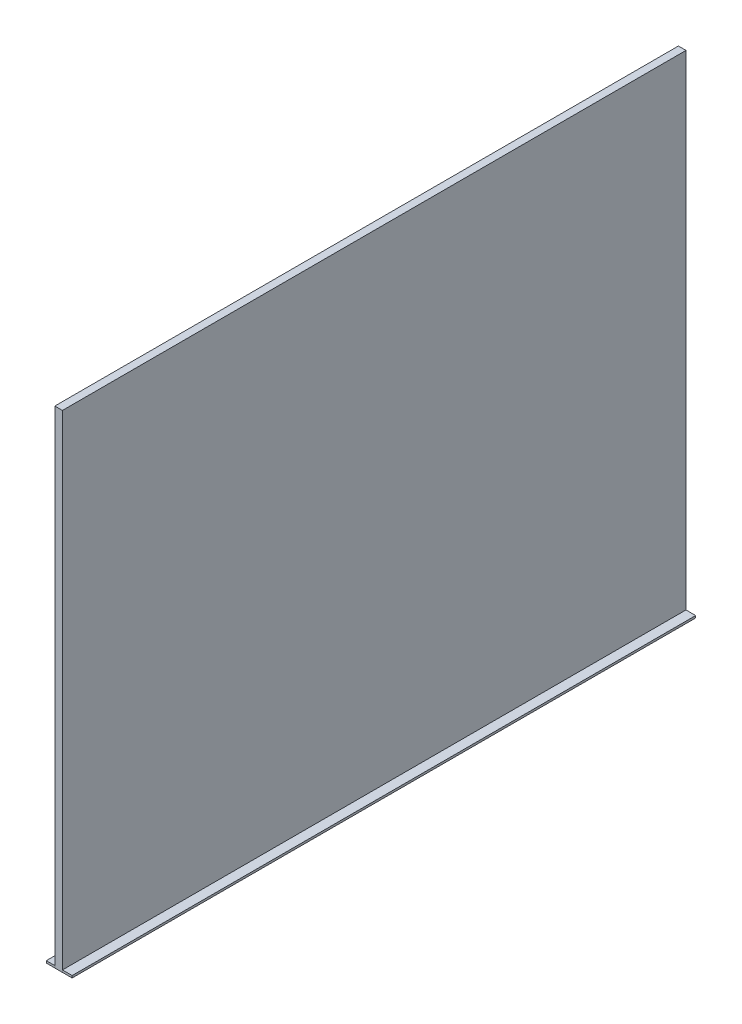
ISO-10303-21;
HEADER;
FILE_DESCRIPTION(('STEP AP214'),'2;1');
FILE_NAME('part.step','',(''),(''),'','','');
FILE_SCHEMA(('AUTOMOTIVE_DESIGN { 1 0 10303 214 1 1 1 1 }'));
ENDSEC;
DATA;
#1=APPLICATION_CONTEXT('core data for automotive mechanical design processes');
#2=APPLICATION_PROTOCOL_DEFINITION('international standard','automotive_design',2000,#1);
#3=PRODUCT_CONTEXT('',#1,'mechanical');
#4=PRODUCT('Part','Part','',(#3));
#5=PRODUCT_RELATED_PRODUCT_CATEGORY('part','',(#4));
#6=PRODUCT_DEFINITION_FORMATION('','',#4);
#7=PRODUCT_DEFINITION_CONTEXT('part definition',#1,'design');
#8=PRODUCT_DEFINITION('design','',#6,#7);
#9=PRODUCT_DEFINITION_SHAPE('','',#8);
#10=(LENGTH_UNIT() NAMED_UNIT(*) SI_UNIT(.MILLI.,.METRE.));
#11=(NAMED_UNIT(*) PLANE_ANGLE_UNIT() SI_UNIT($,.RADIAN.));
#12=(NAMED_UNIT(*) SI_UNIT($,.STERADIAN.) SOLID_ANGLE_UNIT());
#13=UNCERTAINTY_MEASURE_WITH_UNIT(LENGTH_MEASURE(1.E-05),#10,'distance_accuracy_value','');
#14=(GEOMETRIC_REPRESENTATION_CONTEXT(3) GLOBAL_UNCERTAINTY_ASSIGNED_CONTEXT((#13)) GLOBAL_UNIT_ASSIGNED_CONTEXT((#10,
#11,#12)) REPRESENTATION_CONTEXT('',''));
#15=CARTESIAN_POINT('',(0.,0.,0.));
#16=DIRECTION('',(0.,0.,1.));
#17=DIRECTION('',(1.,0.,0.));
#18=AXIS2_PLACEMENT_3D('',#15,#16,#17);
#19=CARTESIAN_POINT('',(0.,160.,0.));
#20=DIRECTION('',(1.,0.,0.));
#21=DIRECTION('',(0.,0.,-1.));
#22=AXIS2_PLACEMENT_3D('',#19,#20,#21);
#23=PLANE('',#22);
#24=DIRECTION('',(0.,1.,0.));
#25=VECTOR('',#24,1.);
#26=CARTESIAN_POINT('',(0.,160.,204.984421923481));
#27=LINE('',#26,#25);
#28=CARTESIAN_POINT('',(0.,0.,204.984421923481));
#29=VERTEX_POINT('',#28);
#30=CARTESIAN_POINT('',(0.,0.700000000000006,204.984421923481));
#31=VERTEX_POINT('',#30);
#32=EDGE_CURVE('E122',#29,#31,#27,.T.);
#33=ORIENTED_EDGE('',*,*,#32,.F.);
#34=DIRECTION('',(0.,0.,1.));
#35=VECTOR('',#34,1.);
#36=CARTESIAN_POINT('',(0.,0.,0.));
#37=LINE('',#36,#35);
#38=CARTESIAN_POINT('',(0.,0.,205.));
#39=VERTEX_POINT('',#38);
#40=EDGE_CURVE('E152',#29,#39,#37,.T.);
#41=ORIENTED_EDGE('',*,*,#40,.T.);
#42=DIRECTION('',(0.,-1.,0.));
#43=VECTOR('',#42,1.);
#44=CARTESIAN_POINT('',(0.,160.,205.));
#45=LINE('',#44,#43);
#46=CARTESIAN_POINT('',(0.,160.,205.));
#47=VERTEX_POINT('',#46);
#48=EDGE_CURVE('E11',#47,#39,#45,.T.);
#49=ORIENTED_EDGE('',*,*,#48,.F.);
#50=DIRECTION('',(0.,0.,1.));
#51=VECTOR('',#50,1.);
#52=CARTESIAN_POINT('',(0.,160.,0.));
#53=LINE('',#52,#51);
#54=CARTESIAN_POINT('',(0.,160.,0.));
#55=VERTEX_POINT('',#54);
#56=EDGE_CURVE('E153',#55,#47,#53,.T.);
#57=ORIENTED_EDGE('',*,*,#56,.F.);
#58=DIRECTION('',(0.,-1.,0.));
#59=VECTOR('',#58,1.);
#60=CARTESIAN_POINT('',(0.,160.,0.));
#61=LINE('',#60,#59);
#62=CARTESIAN_POINT('',(0.,0.700000000000006,0.));
#63=VERTEX_POINT('',#62);
#64=EDGE_CURVE('E163',#55,#63,#61,.T.);
#65=ORIENTED_EDGE('',*,*,#64,.T.);
#66=DIRECTION('',(0.,0.,1.));
#67=VECTOR('',#66,1.);
#68=CARTESIAN_POINT('',(0.,0.700000000000006,0.));
#69=LINE('',#68,#67);
#70=EDGE_CURVE('E52',#63,#31,#69,.T.);
#71=ORIENTED_EDGE('',*,*,#70,.T.);
#72=EDGE_LOOP('',(#33,#41,#49,#57,#65,#71));
#73=FACE_BOUND('',#72,.T.);
#74=ADVANCED_FACE('F38',(#73),#23,.F.);
#75=CARTESIAN_POINT('',(2.5,160.,0.));
#76=DIRECTION('',(-1.,0.,0.));
#77=DIRECTION('',(0.,0.,1.));
#78=AXIS2_PLACEMENT_3D('',#75,#76,#77);
#79=PLANE('',#78);
#80=DIRECTION('',(0.,-1.,0.));
#81=VECTOR('',#80,1.);
#82=CARTESIAN_POINT('',(2.50000000000004,160.,204.984421923481));
#83=LINE('',#82,#81);
#84=CARTESIAN_POINT('',(2.50000000000004,0.700000000000006,204.984421923481));
#85=VERTEX_POINT('',#84);
#86=CARTESIAN_POINT('',(2.50000000000004,0.,204.984421923481));
#87=VERTEX_POINT('',#86);
#88=EDGE_CURVE('E60',#85,#87,#83,.T.);
#89=ORIENTED_EDGE('',*,*,#88,.F.);
#90=DIRECTION('',(0.,0.,-1.));
#91=VECTOR('',#90,1.);
#92=CARTESIAN_POINT('',(2.5,0.700000000000006,0.));
#93=LINE('',#92,#91);
#94=CARTESIAN_POINT('',(2.5,0.700000000000006,0.));
#95=VERTEX_POINT('',#94);
#96=EDGE_CURVE('E149',#85,#95,#93,.T.);
#97=ORIENTED_EDGE('',*,*,#96,.T.);
#98=DIRECTION('',(0.,-1.,0.));
#99=VECTOR('',#98,1.);
#100=CARTESIAN_POINT('',(2.5,160.,0.));
#101=LINE('',#100,#99);
#102=CARTESIAN_POINT('',(2.5,160.,0.));
#103=VERTEX_POINT('',#102);
#104=EDGE_CURVE('E171',#103,#95,#101,.T.);
#105=ORIENTED_EDGE('',*,*,#104,.F.);
#106=DIRECTION('',(0.,0.,-1.));
#107=VECTOR('',#106,1.);
#108=CARTESIAN_POINT('',(2.5,160.,0.));
#109=LINE('',#108,#107);
#110=CARTESIAN_POINT('',(2.50000000000004,160.,205.));
#111=VERTEX_POINT('',#110);
#112=EDGE_CURVE('E159',#111,#103,#109,.T.);
#113=ORIENTED_EDGE('',*,*,#112,.F.);
#114=DIRECTION('',(0.,-1.,0.));
#115=VECTOR('',#114,1.);
#116=CARTESIAN_POINT('',(2.50000000000004,160.,205.));
#117=LINE('',#116,#115);
#118=CARTESIAN_POINT('',(2.50000000000004,0.,205.));
#119=VERTEX_POINT('',#118);
#120=EDGE_CURVE('E45',#111,#119,#117,.T.);
#121=ORIENTED_EDGE('',*,*,#120,.T.);
#122=DIRECTION('',(0.,0.,-1.));
#123=VECTOR('',#122,1.);
#124=CARTESIAN_POINT('',(2.5,0.,0.));
#125=LINE('',#124,#123);
#126=EDGE_CURVE('E167',#119,#87,#125,.T.);
#127=ORIENTED_EDGE('',*,*,#126,.T.);
#128=EDGE_LOOP('',(#89,#97,#105,#113,#121,#127));
#129=FACE_BOUND('',#128,.T.);
#130=ADVANCED_FACE('F177',(#129),#79,.F.);
#131=CARTESIAN_POINT('',(0.,160.,205.));
#132=DIRECTION('',(0.,0.,-1.));
#133=DIRECTION('',(-1.,0.,0.));
#134=AXIS2_PLACEMENT_3D('',#131,#132,#133);
#135=PLANE('',#134);
#136=DIRECTION('',(1.,0.,0.));
#137=VECTOR('',#136,1.);
#138=CARTESIAN_POINT('',(0.,0.,205.));
#139=LINE('',#138,#137);
#140=EDGE_CURVE('E165',#39,#119,#139,.T.);
#141=ORIENTED_EDGE('',*,*,#140,.T.);
#142=ORIENTED_EDGE('',*,*,#120,.F.);
#143=DIRECTION('',(1.,0.,0.));
#144=VECTOR('',#143,1.);
#145=CARTESIAN_POINT('',(0.,160.,205.));
#146=LINE('',#145,#144);
#147=EDGE_CURVE('E156',#47,#111,#146,.T.);
#148=ORIENTED_EDGE('',*,*,#147,.F.);
#149=ORIENTED_EDGE('',*,*,#48,.T.);
#150=EDGE_LOOP('',(#141,#142,#148,#149));
#151=FACE_BOUND('',#150,.T.);
#152=ADVANCED_FACE('F217',(#151),#135,.F.);
#153=CARTESIAN_POINT('',(0.,160.,0.));
#154=DIRECTION('',(0.,0.,1.));
#155=DIRECTION('',(1.,0.,0.));
#156=AXIS2_PLACEMENT_3D('',#153,#154,#155);
#157=PLANE('',#156);
#158=ORIENTED_EDGE('',*,*,#104,.T.);
#159=DIRECTION('',(-1.,0.,0.));
#160=VECTOR('',#159,1.);
#161=CARTESIAN_POINT('',(-2.80503713519452,0.7,0.));
#162=LINE('',#161,#160);
#163=CARTESIAN_POINT('',(5.68425014989496,0.7,0.));
#164=VERTEX_POINT('',#163);
#165=EDGE_CURVE('E196',#164,#95,#162,.T.);
#166=ORIENTED_EDGE('',*,*,#165,.F.);
#167=DIRECTION('',(0.,-1.,0.));
#168=VECTOR('',#167,1.);
#169=CARTESIAN_POINT('',(5.68425014989496,0.7,0.));
#170=LINE('',#169,#168);
#171=CARTESIAN_POINT('',(5.68425014989496,0.,0.));
#172=VERTEX_POINT('',#171);
#173=EDGE_CURVE('E144',#164,#172,#170,.T.);
#174=ORIENTED_EDGE('',*,*,#173,.T.);
#175=DIRECTION('',(-1.,0.,0.));
#176=VECTOR('',#175,1.);
#177=CARTESIAN_POINT('',(0.,0.,0.));
#178=LINE('',#177,#176);
#179=CARTESIAN_POINT('',(-2.80503713519452,0.,0.));
#180=VERTEX_POINT('',#179);
#181=EDGE_CURVE('E157',#172,#180,#178,.T.);
#182=ORIENTED_EDGE('',*,*,#181,.T.);
#183=DIRECTION('',(0.,-1.,0.));
#184=VECTOR('',#183,1.);
#185=CARTESIAN_POINT('',(-2.80503713519452,0.7,0.));
#186=LINE('',#185,#184);
#187=CARTESIAN_POINT('',(-2.80503713519452,0.7,0.));
#188=VERTEX_POINT('',#187);
#189=EDGE_CURVE('E195',#188,#180,#186,.T.);
#190=ORIENTED_EDGE('',*,*,#189,.F.);
#191=EDGE_CURVE('E131',#63,#188,#162,.T.);
#192=ORIENTED_EDGE('',*,*,#191,.F.);
#193=ORIENTED_EDGE('',*,*,#64,.F.);
#194=DIRECTION('',(-1.,0.,0.));
#195=VECTOR('',#194,1.);
#196=CARTESIAN_POINT('',(0.,160.,0.));
#197=LINE('',#196,#195);
#198=EDGE_CURVE('E161',#103,#55,#197,.T.);
#199=ORIENTED_EDGE('',*,*,#198,.F.);
#200=EDGE_LOOP('',(#158,#166,#174,#182,#190,#192,#193,#199));
#201=FACE_BOUND('',#200,.T.);
#202=ADVANCED_FACE('F201',(#201),#157,.F.);
#203=CARTESIAN_POINT('',(0.,160.,0.));
#204=DIRECTION('',(0.,1.,0.));
#205=DIRECTION('',(0.,0.,1.));
#206=AXIS2_PLACEMENT_3D('',#203,#204,#205);
#207=PLANE('',#206);
#208=ORIENTED_EDGE('',*,*,#56,.T.);
#209=ORIENTED_EDGE('',*,*,#147,.T.);
#210=ORIENTED_EDGE('',*,*,#112,.T.);
#211=ORIENTED_EDGE('',*,*,#198,.T.);
#212=EDGE_LOOP('',(#208,#209,#210,#211));
#213=FACE_BOUND('',#212,.T.);
#214=ADVANCED_FACE('F215',(#213),#207,.T.);
#215=CARTESIAN_POINT('',(0.,0.,0.));
#216=DIRECTION('',(0.,1.,0.));
#217=DIRECTION('',(0.,0.,1.));
#218=AXIS2_PLACEMENT_3D('',#215,#216,#217);
#219=PLANE('',#218);
#220=ORIENTED_EDGE('',*,*,#181,.F.);
#221=DIRECTION('',(0.,0.,-1.));
#222=VECTOR('',#221,1.);
#223=CARTESIAN_POINT('',(5.68425014989496,0.,0.));
#224=LINE('',#223,#222);
#225=CARTESIAN_POINT('',(5.68425014989496,0.,204.984421923481));
#226=VERTEX_POINT('',#225);
#227=EDGE_CURVE('E135',#226,#172,#224,.T.);
#228=ORIENTED_EDGE('',*,*,#227,.F.);
#229=DIRECTION('',(1.,0.,0.));
#230=VECTOR('',#229,1.);
#231=CARTESIAN_POINT('',(-2.80503713519452,0.,204.984421923481));
#232=LINE('',#231,#230);
#233=EDGE_CURVE('E185',#87,#226,#232,.T.);
#234=ORIENTED_EDGE('',*,*,#233,.F.);
#235=ORIENTED_EDGE('',*,*,#126,.F.);
#236=ORIENTED_EDGE('',*,*,#140,.F.);
#237=ORIENTED_EDGE('',*,*,#40,.F.);
#238=CARTESIAN_POINT('',(-2.80503713519452,0.,204.984421923481));
#239=VERTEX_POINT('',#238);
#240=EDGE_CURVE('E189',#239,#29,#232,.T.);
#241=ORIENTED_EDGE('',*,*,#240,.F.);
#242=DIRECTION('',(0.,0.,1.));
#243=VECTOR('',#242,1.);
#244=CARTESIAN_POINT('',(-2.80503713519452,0.,0.));
#245=LINE('',#244,#243);
#246=EDGE_CURVE('E139',#180,#239,#245,.T.);
#247=ORIENTED_EDGE('',*,*,#246,.F.);
#248=EDGE_LOOP('',(#220,#228,#234,#235,#236,#237,#241,#247));
#249=FACE_BOUND('',#248,.T.);
#250=ADVANCED_FACE('F183',(#249),#219,.F.);
#251=CARTESIAN_POINT('',(5.68425014989496,0.7,0.));
#252=DIRECTION('',(-1.,0.,0.));
#253=DIRECTION('',(0.,0.,1.));
#254=AXIS2_PLACEMENT_3D('',#251,#252,#253);
#255=PLANE('',#254);
#256=ORIENTED_EDGE('',*,*,#227,.T.);
#257=ORIENTED_EDGE('',*,*,#173,.F.);
#258=DIRECTION('',(0.,0.,-1.));
#259=VECTOR('',#258,1.);
#260=CARTESIAN_POINT('',(5.68425014989496,0.7,0.));
#261=LINE('',#260,#259);
#262=CARTESIAN_POINT('',(5.68425014989496,0.7,204.984421923481));
#263=VERTEX_POINT('',#262);
#264=EDGE_CURVE('E124',#263,#164,#261,.T.);
#265=ORIENTED_EDGE('',*,*,#264,.F.);
#266=DIRECTION('',(0.,-1.,0.));
#267=VECTOR('',#266,1.);
#268=CARTESIAN_POINT('',(5.68425014989496,0.7,204.984421923481));
#269=LINE('',#268,#267);
#270=EDGE_CURVE('E140',#263,#226,#269,.T.);
#271=ORIENTED_EDGE('',*,*,#270,.T.);
#272=EDGE_LOOP('',(#256,#257,#265,#271));
#273=FACE_BOUND('',#272,.T.);
#274=ADVANCED_FACE('F205',(#273),#255,.F.);
#275=CARTESIAN_POINT('',(0.,0.7,0.));
#276=DIRECTION('',(0.,1.,0.));
#277=DIRECTION('',(0.,0.,1.));
#278=AXIS2_PLACEMENT_3D('',#275,#276,#277);
#279=PLANE('',#278);
#280=ORIENTED_EDGE('',*,*,#96,.F.);
#281=DIRECTION('',(1.,0.,0.));
#282=VECTOR('',#281,1.);
#283=CARTESIAN_POINT('',(-2.80503713519452,0.7,204.984421923481));
#284=LINE('',#283,#282);
#285=EDGE_CURVE('E125',#85,#263,#284,.T.);
#286=ORIENTED_EDGE('',*,*,#285,.T.);
#287=ORIENTED_EDGE('',*,*,#264,.T.);
#288=ORIENTED_EDGE('',*,*,#165,.T.);
#289=EDGE_LOOP('',(#280,#286,#287,#288));
#290=FACE_BOUND('',#289,.T.);
#291=ADVANCED_FACE('F210',(#290),#279,.T.);
#292=CARTESIAN_POINT('',(-2.80503713519452,0.7,204.984421923481));
#293=DIRECTION('',(0.,0.,-1.));
#294=DIRECTION('',(-1.,0.,0.));
#295=AXIS2_PLACEMENT_3D('',#292,#293,#294);
#296=PLANE('',#295);
#297=ORIENTED_EDGE('',*,*,#285,.F.);
#298=ORIENTED_EDGE('',*,*,#88,.T.);
#299=ORIENTED_EDGE('',*,*,#233,.T.);
#300=ORIENTED_EDGE('',*,*,#270,.F.);
#301=EDGE_LOOP('',(#297,#298,#299,#300));
#302=FACE_BOUND('',#301,.T.);
#303=ADVANCED_FACE('F207',(#302),#296,.F.);
#304=ORIENTED_EDGE('',*,*,#70,.F.);
#305=ORIENTED_EDGE('',*,*,#191,.T.);
#306=DIRECTION('',(0.,0.,1.));
#307=VECTOR('',#306,1.);
#308=CARTESIAN_POINT('',(-2.80503713519452,0.7,0.));
#309=LINE('',#308,#307);
#310=CARTESIAN_POINT('',(-2.80503713519452,0.7,204.984421923481));
#311=VERTEX_POINT('',#310);
#312=EDGE_CURVE('E128',#188,#311,#309,.T.);
#313=ORIENTED_EDGE('',*,*,#312,.T.);
#314=EDGE_CURVE('E115',#311,#31,#284,.T.);
#315=ORIENTED_EDGE('',*,*,#314,.T.);
#316=EDGE_LOOP('',(#304,#305,#313,#315));
#317=FACE_BOUND('',#316,.T.);
#318=ADVANCED_FACE('F129',(#317),#279,.T.);
#319=ORIENTED_EDGE('',*,*,#240,.T.);
#320=ORIENTED_EDGE('',*,*,#32,.T.);
#321=ORIENTED_EDGE('',*,*,#314,.F.);
#322=DIRECTION('',(0.,-1.,0.));
#323=VECTOR('',#322,1.);
#324=CARTESIAN_POINT('',(-2.80503713519452,0.7,204.984421923481));
#325=LINE('',#324,#323);
#326=EDGE_CURVE('E120',#311,#239,#325,.T.);
#327=ORIENTED_EDGE('',*,*,#326,.T.);
#328=EDGE_LOOP('',(#319,#320,#321,#327));
#329=FACE_BOUND('',#328,.T.);
#330=ADVANCED_FACE('F118',(#329),#296,.F.);
#331=CARTESIAN_POINT('',(-2.80503713519452,0.7,0.));
#332=DIRECTION('',(1.,0.,0.));
#333=DIRECTION('',(0.,0.,-1.));
#334=AXIS2_PLACEMENT_3D('',#331,#332,#333);
#335=PLANE('',#334);
#336=ORIENTED_EDGE('',*,*,#246,.T.);
#337=ORIENTED_EDGE('',*,*,#326,.F.);
#338=ORIENTED_EDGE('',*,*,#312,.F.);
#339=ORIENTED_EDGE('',*,*,#189,.T.);
#340=EDGE_LOOP('',(#336,#337,#338,#339));
#341=FACE_BOUND('',#340,.T.);
#342=ADVANCED_FACE('F137',(#341),#335,.F.);
#343=CLOSED_SHELL('',(#74,#130,#152,#202,#214,#250,#274,#291,#303,#318,#330,#342));
#344=MANIFOLD_SOLID_BREP('B2',#343);
#345=ADVANCED_BREP_SHAPE_REPRESENTATION('',(#18,#344),#14);
#346=SHAPE_DEFINITION_REPRESENTATION(#9,#345);
ENDSEC;
END-ISO-10303-21;
